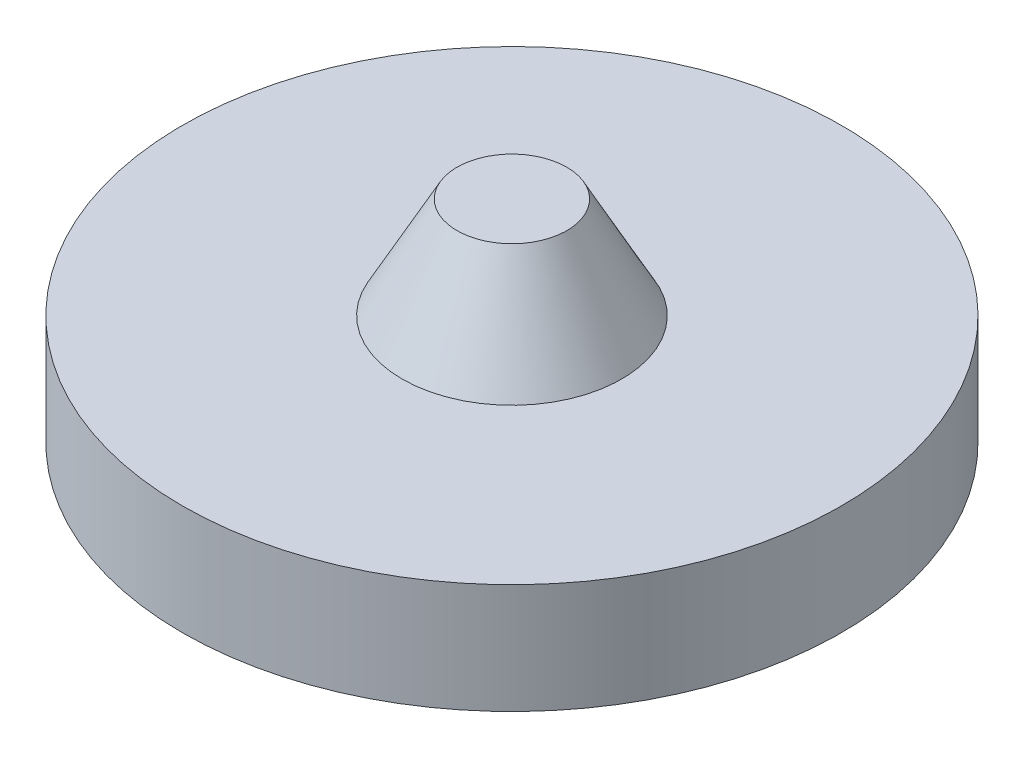
ISO-10303-21;
HEADER;
FILE_DESCRIPTION(('STEP AP214'),'2;1');
FILE_NAME('part.step','',(''),(''),'','','');
FILE_SCHEMA(('AUTOMOTIVE_DESIGN { 1 0 10303 214 1 1 1 1 }'));
ENDSEC;
DATA;
#1=APPLICATION_CONTEXT('core data for automotive mechanical design processes');
#2=APPLICATION_PROTOCOL_DEFINITION('international standard','automotive_design',2000,#1);
#3=PRODUCT_CONTEXT('',#1,'mechanical');
#4=PRODUCT('Part','Part','',(#3));
#5=PRODUCT_RELATED_PRODUCT_CATEGORY('part','',(#4));
#6=PRODUCT_DEFINITION_FORMATION('','',#4);
#7=PRODUCT_DEFINITION_CONTEXT('part definition',#1,'design');
#8=PRODUCT_DEFINITION('design','',#6,#7);
#9=PRODUCT_DEFINITION_SHAPE('','',#8);
#10=(LENGTH_UNIT() NAMED_UNIT(*) SI_UNIT(.MILLI.,.METRE.));
#11=(NAMED_UNIT(*) PLANE_ANGLE_UNIT() SI_UNIT($,.RADIAN.));
#12=(NAMED_UNIT(*) SI_UNIT($,.STERADIAN.) SOLID_ANGLE_UNIT());
#13=UNCERTAINTY_MEASURE_WITH_UNIT(LENGTH_MEASURE(1.E-05),#10,'distance_accuracy_value','');
#14=(GEOMETRIC_REPRESENTATION_CONTEXT(3) GLOBAL_UNCERTAINTY_ASSIGNED_CONTEXT((#13)) GLOBAL_UNIT_ASSIGNED_CONTEXT((#10,
#11,#12)) REPRESENTATION_CONTEXT('',''));
#15=CARTESIAN_POINT('',(0.,0.,0.));
#16=DIRECTION('',(0.,0.,1.));
#17=DIRECTION('',(1.,0.,0.));
#18=AXIS2_PLACEMENT_3D('',#15,#16,#17);
#19=CARTESIAN_POINT('',(0.,1.,0.));
#20=DIRECTION('',(0.,-1.,0.));
#21=DIRECTION('',(0.,0.,-1.));
#22=AXIS2_PLACEMENT_3D('',#19,#20,#21);
#23=CYLINDRICAL_SURFACE('',#22,6.);
#24=CARTESIAN_POINT('',(0.,1.,0.));
#25=DIRECTION('',(0.,1.,0.));
#26=DIRECTION('',(0.,0.,1.));
#27=AXIS2_PLACEMENT_3D('',#24,#25,#26);
#28=CIRCLE('',#27,6.);
#29=CARTESIAN_POINT('',(0.,1.,6.));
#30=VERTEX_POINT('',#29);
#31=EDGE_CURVE('E10',#30,#30,#28,.T.);
#32=ORIENTED_EDGE('',*,*,#31,.F.);
#33=EDGE_LOOP('',(#32));
#34=FACE_BOUND('',#33,.T.);
#35=CARTESIAN_POINT('',(0.,-1.,0.));
#36=DIRECTION('',(0.,1.,0.));
#37=DIRECTION('',(0.,0.,1.));
#38=AXIS2_PLACEMENT_3D('',#35,#36,#37);
#39=CIRCLE('',#38,6.);
#40=CARTESIAN_POINT('',(0.,-1.,6.));
#41=VERTEX_POINT('',#40);
#42=EDGE_CURVE('E40',#41,#41,#39,.T.);
#43=ORIENTED_EDGE('',*,*,#42,.T.);
#44=EDGE_LOOP('',(#43));
#45=FACE_BOUND('',#44,.T.);
#46=ADVANCED_FACE('F37',(#34,#45),#23,.T.);
#47=CARTESIAN_POINT('',(0.,1.,0.));
#48=DIRECTION('',(0.,1.,0.));
#49=DIRECTION('',(0.,0.,1.));
#50=AXIS2_PLACEMENT_3D('',#47,#48,#49);
#51=PLANE('',#50);
#52=CARTESIAN_POINT('',(0.,1.,0.));
#53=DIRECTION('',(0.,-1.,0.));
#54=DIRECTION('',(0.,0.,-1.));
#55=AXIS2_PLACEMENT_3D('',#52,#53,#54);
#56=CIRCLE('',#55,2.);
#57=CARTESIAN_POINT('',(0.,1.,-2.));
#58=VERTEX_POINT('',#57);
#59=EDGE_CURVE('E49',#58,#58,#56,.T.);
#60=ORIENTED_EDGE('',*,*,#59,.T.);
#61=EDGE_LOOP('',(#60));
#62=FACE_BOUND('',#61,.T.);
#63=ORIENTED_EDGE('',*,*,#31,.T.);
#64=EDGE_LOOP('',(#63));
#65=FACE_BOUND('',#64,.T.);
#66=ADVANCED_FACE('F71',(#62,#65),#51,.T.);
#67=CARTESIAN_POINT('',(0.,-1.,0.));
#68=DIRECTION('',(0.,1.,0.));
#69=DIRECTION('',(0.,0.,1.));
#70=AXIS2_PLACEMENT_3D('',#67,#68,#69);
#71=PLANE('',#70);
#72=ORIENTED_EDGE('',*,*,#42,.F.);
#73=EDGE_LOOP('',(#72));
#74=FACE_BOUND('',#73,.T.);
#75=ADVANCED_FACE('F67',(#74),#71,.F.);
#76=CARTESIAN_POINT('',(0.,2.84,0.));
#77=DIRECTION('',(0.,-1.,0.));
#78=DIRECTION('',(0.,0.,-1.));
#79=AXIS2_PLACEMENT_3D('',#76,#77,#78);
#80=CONICAL_SURFACE('',#79,1.,0.497822332617002);
#81=ORIENTED_EDGE('',*,*,#59,.F.);
#82=EDGE_LOOP('',(#81));
#83=FACE_BOUND('',#82,.T.);
#84=CARTESIAN_POINT('',(0.,2.84,0.));
#85=DIRECTION('',(0.,-1.,0.));
#86=DIRECTION('',(0.,0.,-1.));
#87=AXIS2_PLACEMENT_3D('',#84,#85,#86);
#88=CIRCLE('',#87,1.);
#89=CARTESIAN_POINT('',(0.,2.84,-1.));
#90=VERTEX_POINT('',#89);
#91=EDGE_CURVE('E54',#90,#90,#88,.T.);
#92=ORIENTED_EDGE('',*,*,#91,.T.);
#93=EDGE_LOOP('',(#92));
#94=FACE_BOUND('',#93,.T.);
#95=ADVANCED_FACE('F59',(#83,#94),#80,.T.);
#96=CARTESIAN_POINT('',(0.,2.84,1.));
#97=DIRECTION('',(0.,-1.,0.));
#98=DIRECTION('',(0.,0.,-1.));
#99=AXIS2_PLACEMENT_3D('',#96,#97,#98);
#100=PLANE('',#99);
#101=ORIENTED_EDGE('',*,*,#91,.F.);
#102=EDGE_LOOP('',(#101));
#103=FACE_BOUND('',#102,.T.);
#104=ADVANCED_FACE('F61',(#103),#100,.F.);
#105=CLOSED_SHELL('',(#46,#66,#75,#95,#104));
#106=MANIFOLD_SOLID_BREP('B2',#105);
#107=ADVANCED_BREP_SHAPE_REPRESENTATION('',(#18,#106),#14);
#108=SHAPE_DEFINITION_REPRESENTATION(#9,#107);
ENDSEC;
END-ISO-10303-21;
